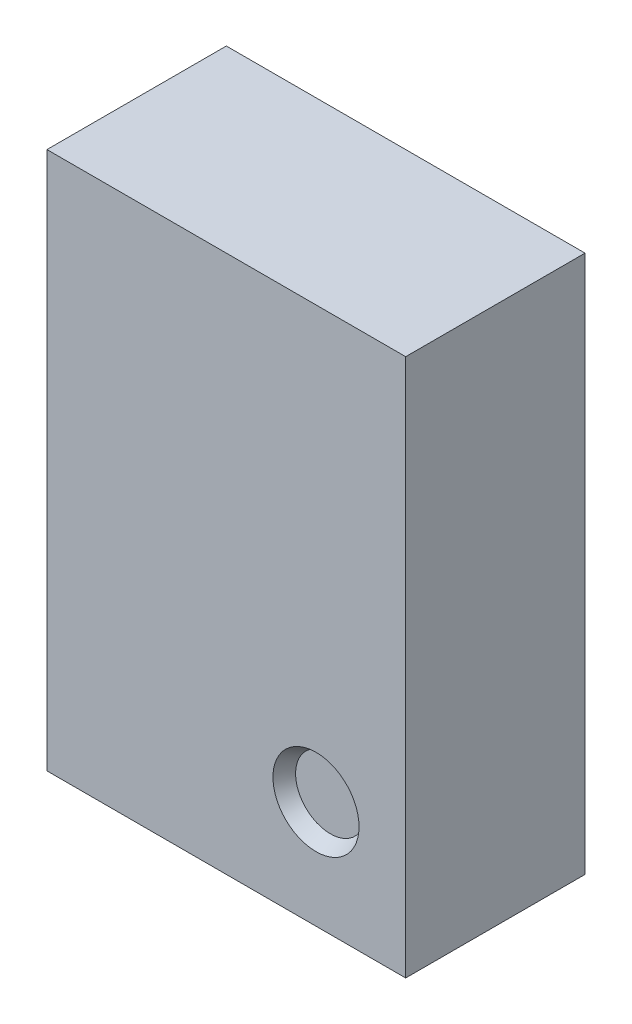
ISO-10303-21;
HEADER;
FILE_DESCRIPTION(('STEP AP214'),'2;1');
FILE_NAME('part.step','',(''),(''),'','','');
FILE_SCHEMA(('AUTOMOTIVE_DESIGN { 1 0 10303 214 1 1 1 1 }'));
ENDSEC;
DATA;
#1=APPLICATION_CONTEXT('core data for automotive mechanical design processes');
#2=APPLICATION_PROTOCOL_DEFINITION('international standard','automotive_design',2000,#1);
#3=PRODUCT_CONTEXT('',#1,'mechanical');
#4=PRODUCT('Part','Part','',(#3));
#5=PRODUCT_RELATED_PRODUCT_CATEGORY('part','',(#4));
#6=PRODUCT_DEFINITION_FORMATION('','',#4);
#7=PRODUCT_DEFINITION_CONTEXT('part definition',#1,'design');
#8=PRODUCT_DEFINITION('design','',#6,#7);
#9=PRODUCT_DEFINITION_SHAPE('','',#8);
#10=(LENGTH_UNIT() NAMED_UNIT(*) SI_UNIT(.MILLI.,.METRE.));
#11=(NAMED_UNIT(*) PLANE_ANGLE_UNIT() SI_UNIT($,.RADIAN.));
#12=(NAMED_UNIT(*) SI_UNIT($,.STERADIAN.) SOLID_ANGLE_UNIT());
#13=UNCERTAINTY_MEASURE_WITH_UNIT(LENGTH_MEASURE(1.E-05),#10,'distance_accuracy_value','');
#14=(GEOMETRIC_REPRESENTATION_CONTEXT(3) GLOBAL_UNCERTAINTY_ASSIGNED_CONTEXT((#13)) GLOBAL_UNIT_ASSIGNED_CONTEXT((#10,
#11,#12)) REPRESENTATION_CONTEXT('',''));
#15=CARTESIAN_POINT('',(0.,0.,0.));
#16=DIRECTION('',(0.,0.,1.));
#17=DIRECTION('',(1.,0.,0.));
#18=AXIS2_PLACEMENT_3D('',#15,#16,#17);
#19=CARTESIAN_POINT('',(80.745,39.36,2.013254));
#20=DIRECTION('',(0.,0.,1.));
#21=DIRECTION('',(1.,0.,0.));
#22=AXIS2_PLACEMENT_3D('',#19,#20,#21);
#23=PLANE('',#22);
#24=DIRECTION('',(0.,-1.,0.));
#25=VECTOR('',#24,1.);
#26=CARTESIAN_POINT('',(81.045,39.36,2.013254));
#27=LINE('',#26,#25);
#28=CARTESIAN_POINT('',(81.045,39.36,2.013254));
#29=VERTEX_POINT('',#28);
#30=CARTESIAN_POINT('',(81.045,39.11,2.013254));
#31=VERTEX_POINT('',#30);
#32=EDGE_CURVE('E201',#29,#31,#27,.T.);
#33=ORIENTED_EDGE('',*,*,#32,.T.);
#34=DIRECTION('',(-1.,0.,0.));
#35=VECTOR('',#34,1.);
#36=CARTESIAN_POINT('',(81.045,39.11,2.013254));
#37=LINE('',#36,#35);
#38=CARTESIAN_POINT('',(80.745,39.11,2.013254));
#39=VERTEX_POINT('',#38);
#40=EDGE_CURVE('E198',#31,#39,#37,.T.);
#41=ORIENTED_EDGE('',*,*,#40,.T.);
#42=DIRECTION('',(0.,1.,0.));
#43=VECTOR('',#42,1.);
#44=CARTESIAN_POINT('',(80.745,39.36,2.013254));
#45=LINE('',#44,#43);
#46=CARTESIAN_POINT('',(80.745,39.36,2.013254));
#47=VERTEX_POINT('',#46);
#48=EDGE_CURVE('E215',#39,#47,#45,.T.);
#49=ORIENTED_EDGE('',*,*,#48,.T.);
#50=DIRECTION('',(1.,0.,0.));
#51=VECTOR('',#50,1.);
#52=CARTESIAN_POINT('',(81.045,39.36,2.013254));
#53=LINE('',#52,#51);
#54=EDGE_CURVE('E204',#47,#29,#53,.T.);
#55=ORIENTED_EDGE('',*,*,#54,.T.);
#56=EDGE_LOOP('',(#33,#41,#49,#55));
#57=FACE_BOUND('',#56,.T.);
#58=ADVANCED_FACE('F17',(#57),#23,.F.);
#59=CARTESIAN_POINT('',(80.545,39.36,2.013254));
#60=DIRECTION('',(0.,0.,-1.));
#61=DIRECTION('',(-1.,0.,0.));
#62=AXIS2_PLACEMENT_3D('',#59,#60,#61);
#63=PLANE('',#62);
#64=DIRECTION('',(-1.,0.,0.));
#65=VECTOR('',#64,1.);
#66=CARTESIAN_POINT('',(80.245,39.11,2.013254));
#67=LINE('',#66,#65);
#68=CARTESIAN_POINT('',(80.545,39.11,2.013254));
#69=VERTEX_POINT('',#68);
#70=CARTESIAN_POINT('',(80.245,39.11,2.013254));
#71=VERTEX_POINT('',#70);
#72=EDGE_CURVE('E233',#69,#71,#67,.T.);
#73=ORIENTED_EDGE('',*,*,#72,.T.);
#74=DIRECTION('',(0.,1.,0.));
#75=VECTOR('',#74,1.);
#76=CARTESIAN_POINT('',(80.245,39.36,2.013254));
#77=LINE('',#76,#75);
#78=CARTESIAN_POINT('',(80.245,39.36,2.013254));
#79=VERTEX_POINT('',#78);
#80=EDGE_CURVE('E238',#71,#79,#77,.T.);
#81=ORIENTED_EDGE('',*,*,#80,.T.);
#82=DIRECTION('',(1.,0.,0.));
#83=VECTOR('',#82,1.);
#84=CARTESIAN_POINT('',(80.245,39.36,2.013254));
#85=LINE('',#84,#83);
#86=CARTESIAN_POINT('',(80.545,39.36,2.013254));
#87=VERTEX_POINT('',#86);
#88=EDGE_CURVE('E243',#79,#87,#85,.T.);
#89=ORIENTED_EDGE('',*,*,#88,.T.);
#90=DIRECTION('',(0.,-1.,0.));
#91=VECTOR('',#90,1.);
#92=CARTESIAN_POINT('',(80.545,39.36,2.013254));
#93=LINE('',#92,#91);
#94=EDGE_CURVE('E231',#87,#69,#93,.T.);
#95=ORIENTED_EDGE('',*,*,#94,.T.);
#96=EDGE_LOOP('',(#73,#81,#89,#95));
#97=FACE_BOUND('',#96,.T.);
#98=ADVANCED_FACE('F563',(#97),#63,.T.);
#99=CARTESIAN_POINT('',(80.545,38.36,2.013254));
#100=DIRECTION('',(0.,0.,1.));
#101=DIRECTION('',(1.,0.,0.));
#102=AXIS2_PLACEMENT_3D('',#99,#100,#101);
#103=PLANE('',#102);
#104=DIRECTION('',(0.,-1.,0.));
#105=VECTOR('',#104,1.);
#106=CARTESIAN_POINT('',(80.545,38.11,2.013254));
#107=LINE('',#106,#105);
#108=CARTESIAN_POINT('',(80.545,38.36,2.013254));
#109=VERTEX_POINT('',#108);
#110=CARTESIAN_POINT('',(80.545,38.11,2.013254));
#111=VERTEX_POINT('',#110);
#112=EDGE_CURVE('E250',#109,#111,#107,.T.);
#113=ORIENTED_EDGE('',*,*,#112,.T.);
#114=DIRECTION('',(-1.,0.,0.));
#115=VECTOR('',#114,1.);
#116=CARTESIAN_POINT('',(80.245,38.11,2.013254));
#117=LINE('',#116,#115);
#118=CARTESIAN_POINT('',(80.245,38.11,2.013254));
#119=VERTEX_POINT('',#118);
#120=EDGE_CURVE('E252',#111,#119,#117,.T.);
#121=ORIENTED_EDGE('',*,*,#120,.T.);
#122=DIRECTION('',(0.,1.,0.));
#123=VECTOR('',#122,1.);
#124=CARTESIAN_POINT('',(80.245,38.11,2.013254));
#125=LINE('',#124,#123);
#126=CARTESIAN_POINT('',(80.245,38.36,2.013254));
#127=VERTEX_POINT('',#126);
#128=EDGE_CURVE('E257',#119,#127,#125,.T.);
#129=ORIENTED_EDGE('',*,*,#128,.T.);
#130=DIRECTION('',(1.,0.,0.));
#131=VECTOR('',#130,1.);
#132=CARTESIAN_POINT('',(80.245,38.36,2.013254));
#133=LINE('',#132,#131);
#134=EDGE_CURVE('E262',#127,#109,#133,.T.);
#135=ORIENTED_EDGE('',*,*,#134,.T.);
#136=EDGE_LOOP('',(#113,#121,#129,#135));
#137=FACE_BOUND('',#136,.T.);
#138=ADVANCED_FACE('F560',(#137),#103,.F.);
#139=CARTESIAN_POINT('',(80.545,38.86,2.013254));
#140=DIRECTION('',(0.,0.,-1.));
#141=DIRECTION('',(-1.,0.,0.));
#142=AXIS2_PLACEMENT_3D('',#139,#140,#141);
#143=PLANE('',#142);
#144=DIRECTION('',(-1.,0.,0.));
#145=VECTOR('',#144,1.);
#146=CARTESIAN_POINT('',(80.245,38.61,2.013254));
#147=LINE('',#146,#145);
#148=CARTESIAN_POINT('',(80.545,38.61,2.013254));
#149=VERTEX_POINT('',#148);
#150=CARTESIAN_POINT('',(80.245,38.61,2.013254));
#151=VERTEX_POINT('',#150);
#152=EDGE_CURVE('E271',#149,#151,#147,.T.);
#153=ORIENTED_EDGE('',*,*,#152,.T.);
#154=DIRECTION('',(0.,1.,0.));
#155=VECTOR('',#154,1.);
#156=CARTESIAN_POINT('',(80.245,38.86,2.013254));
#157=LINE('',#156,#155);
#158=CARTESIAN_POINT('',(80.245,38.86,2.013254));
#159=VERTEX_POINT('',#158);
#160=EDGE_CURVE('E276',#151,#159,#157,.T.);
#161=ORIENTED_EDGE('',*,*,#160,.T.);
#162=DIRECTION('',(1.,0.,0.));
#163=VECTOR('',#162,1.);
#164=CARTESIAN_POINT('',(80.245,38.86,2.013254));
#165=LINE('',#164,#163);
#166=CARTESIAN_POINT('',(80.545,38.86,2.013254));
#167=VERTEX_POINT('',#166);
#168=EDGE_CURVE('E281',#159,#167,#165,.T.);
#169=ORIENTED_EDGE('',*,*,#168,.T.);
#170=DIRECTION('',(0.,-1.,0.));
#171=VECTOR('',#170,1.);
#172=CARTESIAN_POINT('',(80.545,38.86,2.013254));
#173=LINE('',#172,#171);
#174=EDGE_CURVE('E269',#167,#149,#173,.T.);
#175=ORIENTED_EDGE('',*,*,#174,.T.);
#176=EDGE_LOOP('',(#153,#161,#169,#175));
#177=FACE_BOUND('',#176,.T.);
#178=ADVANCED_FACE('F556',(#177),#143,.T.);
#179=CARTESIAN_POINT('',(80.745,38.86,2.013254));
#180=DIRECTION('',(0.,0.,1.));
#181=DIRECTION('',(1.,0.,0.));
#182=AXIS2_PLACEMENT_3D('',#179,#180,#181);
#183=PLANE('',#182);
#184=DIRECTION('',(0.,-1.,0.));
#185=VECTOR('',#184,1.);
#186=CARTESIAN_POINT('',(81.045,38.86,2.013254));
#187=LINE('',#186,#185);
#188=CARTESIAN_POINT('',(81.045,38.86,2.013254));
#189=VERTEX_POINT('',#188);
#190=CARTESIAN_POINT('',(81.045,38.61,2.013254));
#191=VERTEX_POINT('',#190);
#192=EDGE_CURVE('E288',#189,#191,#187,.T.);
#193=ORIENTED_EDGE('',*,*,#192,.T.);
#194=DIRECTION('',(-1.,0.,0.));
#195=VECTOR('',#194,1.);
#196=CARTESIAN_POINT('',(81.045,38.61,2.013254));
#197=LINE('',#196,#195);
#198=CARTESIAN_POINT('',(80.745,38.61,2.013254));
#199=VERTEX_POINT('',#198);
#200=EDGE_CURVE('E290',#191,#199,#197,.T.);
#201=ORIENTED_EDGE('',*,*,#200,.T.);
#202=DIRECTION('',(0.,1.,0.));
#203=VECTOR('',#202,1.);
#204=CARTESIAN_POINT('',(80.745,38.86,2.013254));
#205=LINE('',#204,#203);
#206=CARTESIAN_POINT('',(80.745,38.86,2.013254));
#207=VERTEX_POINT('',#206);
#208=EDGE_CURVE('E295',#199,#207,#205,.T.);
#209=ORIENTED_EDGE('',*,*,#208,.T.);
#210=DIRECTION('',(1.,0.,0.));
#211=VECTOR('',#210,1.);
#212=CARTESIAN_POINT('',(81.045,38.86,2.013254));
#213=LINE('',#212,#211);
#214=EDGE_CURVE('E300',#207,#189,#213,.T.);
#215=ORIENTED_EDGE('',*,*,#214,.T.);
#216=EDGE_LOOP('',(#193,#201,#209,#215));
#217=FACE_BOUND('',#216,.T.);
#218=ADVANCED_FACE('F552',(#217),#183,.F.);
#219=CARTESIAN_POINT('',(80.745,38.11,2.013254));
#220=DIRECTION('',(0.,0.,-1.));
#221=DIRECTION('',(-1.,0.,0.));
#222=AXIS2_PLACEMENT_3D('',#219,#220,#221);
#223=PLANE('',#222);
#224=DIRECTION('',(1.,0.,0.));
#225=VECTOR('',#224,1.);
#226=CARTESIAN_POINT('',(81.045,38.36,2.013254));
#227=LINE('',#226,#225);
#228=CARTESIAN_POINT('',(80.745,38.36,2.013254));
#229=VERTEX_POINT('',#228);
#230=CARTESIAN_POINT('',(81.045,38.36,2.013254));
#231=VERTEX_POINT('',#230);
#232=EDGE_CURVE('E309',#229,#231,#227,.T.);
#233=ORIENTED_EDGE('',*,*,#232,.T.);
#234=DIRECTION('',(0.,-1.,0.));
#235=VECTOR('',#234,1.);
#236=CARTESIAN_POINT('',(81.045,38.11,2.013254));
#237=LINE('',#236,#235);
#238=CARTESIAN_POINT('',(81.045,38.11,2.013254));
#239=VERTEX_POINT('',#238);
#240=EDGE_CURVE('E314',#231,#239,#237,.T.);
#241=ORIENTED_EDGE('',*,*,#240,.T.);
#242=DIRECTION('',(-1.,0.,0.));
#243=VECTOR('',#242,1.);
#244=CARTESIAN_POINT('',(81.045,38.11,2.013254));
#245=LINE('',#244,#243);
#246=CARTESIAN_POINT('',(80.745,38.11,2.013254));
#247=VERTEX_POINT('',#246);
#248=EDGE_CURVE('E319',#239,#247,#245,.T.);
#249=ORIENTED_EDGE('',*,*,#248,.T.);
#250=DIRECTION('',(0.,1.,0.));
#251=VECTOR('',#250,1.);
#252=CARTESIAN_POINT('',(80.745,38.11,2.013254));
#253=LINE('',#252,#251);
#254=EDGE_CURVE('E307',#247,#229,#253,.T.);
#255=ORIENTED_EDGE('',*,*,#254,.T.);
#256=EDGE_LOOP('',(#233,#241,#249,#255));
#257=FACE_BOUND('',#256,.T.);
#258=ADVANCED_FACE('F549',(#257),#223,.T.);
#259=CARTESIAN_POINT('',(81.045,39.36,2.213254));
#260=DIRECTION('',(-1.,0.,0.));
#261=DIRECTION('',(0.,-1.,0.));
#262=AXIS2_PLACEMENT_3D('',#259,#260,#261);
#263=PLANE('',#262);
#264=DIRECTION('',(0.,1.,0.));
#265=VECTOR('',#264,1.);
#266=CARTESIAN_POINT('',(81.045,37.985,2.023254));
#267=LINE('',#266,#265);
#268=CARTESIAN_POINT('',(81.045,39.36,2.023254));
#269=VERTEX_POINT('',#268);
#270=CARTESIAN_POINT('',(81.045,39.11,2.023254));
#271=VERTEX_POINT('',#270);
#272=EDGE_CURVE('E212',#269,#271,#267,.F.);
#273=ORIENTED_EDGE('',*,*,#272,.T.);
#274=DIRECTION('',(0.,0.,1.));
#275=VECTOR('',#274,1.);
#276=CARTESIAN_POINT('',(81.045,39.11,2.213254));
#277=LINE('',#276,#275);
#278=EDGE_CURVE('E209',#271,#31,#277,.F.);
#279=ORIENTED_EDGE('',*,*,#278,.T.);
#280=ORIENTED_EDGE('',*,*,#32,.F.);
#281=DIRECTION('',(0.,0.,1.));
#282=VECTOR('',#281,1.);
#283=CARTESIAN_POINT('',(81.045,39.36,2.213254));
#284=LINE('',#283,#282);
#285=EDGE_CURVE('E226',#29,#269,#284,.T.);
#286=ORIENTED_EDGE('',*,*,#285,.T.);
#287=EDGE_LOOP('',(#273,#279,#280,#286));
#288=FACE_BOUND('',#287,.T.);
#289=ADVANCED_FACE('F210',(#288),#263,.F.);
#290=CARTESIAN_POINT('',(81.045,39.11,2.213254));
#291=DIRECTION('',(0.,1.,0.));
#292=DIRECTION('',(-1.,0.,0.));
#293=AXIS2_PLACEMENT_3D('',#290,#291,#292);
#294=PLANE('',#293);
#295=DIRECTION('',(1.,0.,0.));
#296=VECTOR('',#295,1.);
#297=CARTESIAN_POINT('',(81.145,39.11,2.023254));
#298=LINE('',#297,#296);
#299=CARTESIAN_POINT('',(80.745,39.11,2.023254));
#300=VERTEX_POINT('',#299);
#301=EDGE_CURVE('E327',#271,#300,#298,.F.);
#302=ORIENTED_EDGE('',*,*,#301,.T.);
#303=DIRECTION('',(0.,0.,1.));
#304=VECTOR('',#303,1.);
#305=CARTESIAN_POINT('',(80.745,39.11,2.213254));
#306=LINE('',#305,#304);
#307=EDGE_CURVE('E219',#300,#39,#306,.F.);
#308=ORIENTED_EDGE('',*,*,#307,.T.);
#309=ORIENTED_EDGE('',*,*,#40,.F.);
#310=ORIENTED_EDGE('',*,*,#278,.F.);
#311=EDGE_LOOP('',(#302,#308,#309,#310));
#312=FACE_BOUND('',#311,.T.);
#313=ADVANCED_FACE('F217',(#312),#294,.F.);
#314=CARTESIAN_POINT('',(80.745,39.36,2.213254));
#315=DIRECTION('',(1.,0.,0.));
#316=DIRECTION('',(0.,1.,0.));
#317=AXIS2_PLACEMENT_3D('',#314,#315,#316);
#318=PLANE('',#317);
#319=DIRECTION('',(0.,1.,0.));
#320=VECTOR('',#319,1.);
#321=CARTESIAN_POINT('',(80.745,37.985,2.023254));
#322=LINE('',#321,#320);
#323=CARTESIAN_POINT('',(80.745,39.36,2.023254));
#324=VERTEX_POINT('',#323);
#325=EDGE_CURVE('E329',#300,#324,#322,.T.);
#326=ORIENTED_EDGE('',*,*,#325,.T.);
#327=DIRECTION('',(0.,0.,1.));
#328=VECTOR('',#327,1.);
#329=CARTESIAN_POINT('',(80.745,39.36,2.213254));
#330=LINE('',#329,#328);
#331=EDGE_CURVE('E228',#324,#47,#330,.F.);
#332=ORIENTED_EDGE('',*,*,#331,.T.);
#333=ORIENTED_EDGE('',*,*,#48,.F.);
#334=ORIENTED_EDGE('',*,*,#307,.F.);
#335=EDGE_LOOP('',(#326,#332,#333,#334));
#336=FACE_BOUND('',#335,.T.);
#337=ADVANCED_FACE('F540',(#336),#318,.F.);
#338=CARTESIAN_POINT('',(81.045,39.36,2.213254));
#339=DIRECTION('',(0.,-1.,0.));
#340=DIRECTION('',(1.,0.,0.));
#341=AXIS2_PLACEMENT_3D('',#338,#339,#340);
#342=PLANE('',#341);
#343=DIRECTION('',(1.,0.,0.));
#344=VECTOR('',#343,1.);
#345=CARTESIAN_POINT('',(81.145,39.36,2.023254));
#346=LINE('',#345,#344);
#347=EDGE_CURVE('E331',#324,#269,#346,.T.);
#348=ORIENTED_EDGE('',*,*,#347,.T.);
#349=ORIENTED_EDGE('',*,*,#285,.F.);
#350=ORIENTED_EDGE('',*,*,#54,.F.);
#351=ORIENTED_EDGE('',*,*,#331,.F.);
#352=EDGE_LOOP('',(#348,#349,#350,#351));
#353=FACE_BOUND('',#352,.T.);
#354=ADVANCED_FACE('F536',(#353),#342,.F.);
#355=CARTESIAN_POINT('',(80.545,39.36,2.213254));
#356=DIRECTION('',(-1.,0.,0.));
#357=DIRECTION('',(0.,-1.,0.));
#358=AXIS2_PLACEMENT_3D('',#355,#356,#357);
#359=PLANE('',#358);
#360=DIRECTION('',(0.,1.,0.));
#361=VECTOR('',#360,1.);
#362=CARTESIAN_POINT('',(80.545,37.985,2.023254));
#363=LINE('',#362,#361);
#364=CARTESIAN_POINT('',(80.545,39.36,2.023254));
#365=VERTEX_POINT('',#364);
#366=CARTESIAN_POINT('',(80.545,39.11,2.023254));
#367=VERTEX_POINT('',#366);
#368=EDGE_CURVE('E334',#365,#367,#363,.F.);
#369=ORIENTED_EDGE('',*,*,#368,.T.);
#370=DIRECTION('',(0.,0.,1.));
#371=VECTOR('',#370,1.);
#372=CARTESIAN_POINT('',(80.545,39.11,2.213254));
#373=LINE('',#372,#371);
#374=EDGE_CURVE('E235',#367,#69,#373,.F.);
#375=ORIENTED_EDGE('',*,*,#374,.T.);
#376=ORIENTED_EDGE('',*,*,#94,.F.);
#377=DIRECTION('',(0.,0.,1.));
#378=VECTOR('',#377,1.);
#379=CARTESIAN_POINT('',(80.545,39.36,2.213254));
#380=LINE('',#379,#378);
#381=EDGE_CURVE('E245',#87,#365,#380,.T.);
#382=ORIENTED_EDGE('',*,*,#381,.T.);
#383=EDGE_LOOP('',(#369,#375,#376,#382));
#384=FACE_BOUND('',#383,.T.);
#385=ADVANCED_FACE('F532',(#384),#359,.F.);
#386=CARTESIAN_POINT('',(80.245,39.11,2.213254));
#387=DIRECTION('',(0.,1.,0.));
#388=DIRECTION('',(-1.,0.,0.));
#389=AXIS2_PLACEMENT_3D('',#386,#387,#388);
#390=PLANE('',#389);
#391=DIRECTION('',(1.,0.,0.));
#392=VECTOR('',#391,1.);
#393=CARTESIAN_POINT('',(81.145,39.11,2.023254));
#394=LINE('',#393,#392);
#395=CARTESIAN_POINT('',(80.245,39.11,2.023254));
#396=VERTEX_POINT('',#395);
#397=EDGE_CURVE('E336',#367,#396,#394,.F.);
#398=ORIENTED_EDGE('',*,*,#397,.T.);
#399=DIRECTION('',(0.,0.,1.));
#400=VECTOR('',#399,1.);
#401=CARTESIAN_POINT('',(80.245,39.11,2.213254));
#402=LINE('',#401,#400);
#403=EDGE_CURVE('E240',#396,#71,#402,.F.);
#404=ORIENTED_EDGE('',*,*,#403,.T.);
#405=ORIENTED_EDGE('',*,*,#72,.F.);
#406=ORIENTED_EDGE('',*,*,#374,.F.);
#407=EDGE_LOOP('',(#398,#404,#405,#406));
#408=FACE_BOUND('',#407,.T.);
#409=ADVANCED_FACE('F528',(#408),#390,.F.);
#410=CARTESIAN_POINT('',(80.245,39.36,2.213254));
#411=DIRECTION('',(1.,0.,0.));
#412=DIRECTION('',(0.,1.,0.));
#413=AXIS2_PLACEMENT_3D('',#410,#411,#412);
#414=PLANE('',#413);
#415=DIRECTION('',(0.,1.,0.));
#416=VECTOR('',#415,1.);
#417=CARTESIAN_POINT('',(80.245,37.985,2.023254));
#418=LINE('',#417,#416);
#419=CARTESIAN_POINT('',(80.245,39.36,2.023254));
#420=VERTEX_POINT('',#419);
#421=EDGE_CURVE('E338',#396,#420,#418,.T.);
#422=ORIENTED_EDGE('',*,*,#421,.T.);
#423=DIRECTION('',(0.,0.,1.));
#424=VECTOR('',#423,1.);
#425=CARTESIAN_POINT('',(80.245,39.36,2.213254));
#426=LINE('',#425,#424);
#427=EDGE_CURVE('E247',#420,#79,#426,.F.);
#428=ORIENTED_EDGE('',*,*,#427,.T.);
#429=ORIENTED_EDGE('',*,*,#80,.F.);
#430=ORIENTED_EDGE('',*,*,#403,.F.);
#431=EDGE_LOOP('',(#422,#428,#429,#430));
#432=FACE_BOUND('',#431,.T.);
#433=ADVANCED_FACE('F524',(#432),#414,.F.);
#434=CARTESIAN_POINT('',(80.245,39.36,2.213254));
#435=DIRECTION('',(0.,-1.,0.));
#436=DIRECTION('',(1.,0.,0.));
#437=AXIS2_PLACEMENT_3D('',#434,#435,#436);
#438=PLANE('',#437);
#439=DIRECTION('',(1.,0.,0.));
#440=VECTOR('',#439,1.);
#441=CARTESIAN_POINT('',(81.145,39.36,2.023254));
#442=LINE('',#441,#440);
#443=EDGE_CURVE('E340',#420,#365,#442,.T.);
#444=ORIENTED_EDGE('',*,*,#443,.T.);
#445=ORIENTED_EDGE('',*,*,#381,.F.);
#446=ORIENTED_EDGE('',*,*,#88,.F.);
#447=ORIENTED_EDGE('',*,*,#427,.F.);
#448=EDGE_LOOP('',(#444,#445,#446,#447));
#449=FACE_BOUND('',#448,.T.);
#450=ADVANCED_FACE('F520',(#449),#438,.F.);
#451=CARTESIAN_POINT('',(80.545,38.11,2.213254));
#452=DIRECTION('',(-1.,0.,0.));
#453=DIRECTION('',(0.,-1.,0.));
#454=AXIS2_PLACEMENT_3D('',#451,#452,#453);
#455=PLANE('',#454);
#456=DIRECTION('',(0.,1.,0.));
#457=VECTOR('',#456,1.);
#458=CARTESIAN_POINT('',(80.545,37.985,2.023254));
#459=LINE('',#458,#457);
#460=CARTESIAN_POINT('',(80.545,38.36,2.023254));
#461=VERTEX_POINT('',#460);
#462=CARTESIAN_POINT('',(80.545,38.11,2.023254));
#463=VERTEX_POINT('',#462);
#464=EDGE_CURVE('E343',#461,#463,#459,.F.);
#465=ORIENTED_EDGE('',*,*,#464,.T.);
#466=DIRECTION('',(0.,0.,1.));
#467=VECTOR('',#466,1.);
#468=CARTESIAN_POINT('',(80.545,38.11,2.213254));
#469=LINE('',#468,#467);
#470=EDGE_CURVE('E254',#463,#111,#469,.F.);
#471=ORIENTED_EDGE('',*,*,#470,.T.);
#472=ORIENTED_EDGE('',*,*,#112,.F.);
#473=DIRECTION('',(0.,0.,1.));
#474=VECTOR('',#473,1.);
#475=CARTESIAN_POINT('',(80.545,38.36,2.213254));
#476=LINE('',#475,#474);
#477=EDGE_CURVE('E264',#109,#461,#476,.T.);
#478=ORIENTED_EDGE('',*,*,#477,.T.);
#479=EDGE_LOOP('',(#465,#471,#472,#478));
#480=FACE_BOUND('',#479,.T.);
#481=ADVANCED_FACE('F516',(#480),#455,.F.);
#482=CARTESIAN_POINT('',(80.245,38.11,2.213254));
#483=DIRECTION('',(0.,1.,0.));
#484=DIRECTION('',(-1.,0.,0.));
#485=AXIS2_PLACEMENT_3D('',#482,#483,#484);
#486=PLANE('',#485);
#487=DIRECTION('',(1.,0.,0.));
#488=VECTOR('',#487,1.);
#489=CARTESIAN_POINT('',(81.145,38.11,2.023254));
#490=LINE('',#489,#488);
#491=CARTESIAN_POINT('',(80.245,38.11,2.023254));
#492=VERTEX_POINT('',#491);
#493=EDGE_CURVE('E345',#463,#492,#490,.F.);
#494=ORIENTED_EDGE('',*,*,#493,.T.);
#495=DIRECTION('',(0.,0.,1.));
#496=VECTOR('',#495,1.);
#497=CARTESIAN_POINT('',(80.245,38.11,2.213254));
#498=LINE('',#497,#496);
#499=EDGE_CURVE('E259',#492,#119,#498,.F.);
#500=ORIENTED_EDGE('',*,*,#499,.T.);
#501=ORIENTED_EDGE('',*,*,#120,.F.);
#502=ORIENTED_EDGE('',*,*,#470,.F.);
#503=EDGE_LOOP('',(#494,#500,#501,#502));
#504=FACE_BOUND('',#503,.T.);
#505=ADVANCED_FACE('F512',(#504),#486,.F.);
#506=CARTESIAN_POINT('',(80.245,38.11,2.213254));
#507=DIRECTION('',(1.,0.,0.));
#508=DIRECTION('',(0.,1.,0.));
#509=AXIS2_PLACEMENT_3D('',#506,#507,#508);
#510=PLANE('',#509);
#511=DIRECTION('',(0.,1.,0.));
#512=VECTOR('',#511,1.);
#513=CARTESIAN_POINT('',(80.245,37.985,2.023254));
#514=LINE('',#513,#512);
#515=CARTESIAN_POINT('',(80.245,38.36,2.023254));
#516=VERTEX_POINT('',#515);
#517=EDGE_CURVE('E347',#492,#516,#514,.T.);
#518=ORIENTED_EDGE('',*,*,#517,.T.);
#519=DIRECTION('',(0.,0.,1.));
#520=VECTOR('',#519,1.);
#521=CARTESIAN_POINT('',(80.245,38.36,2.213254));
#522=LINE('',#521,#520);
#523=EDGE_CURVE('E266',#516,#127,#522,.F.);
#524=ORIENTED_EDGE('',*,*,#523,.T.);
#525=ORIENTED_EDGE('',*,*,#128,.F.);
#526=ORIENTED_EDGE('',*,*,#499,.F.);
#527=EDGE_LOOP('',(#518,#524,#525,#526));
#528=FACE_BOUND('',#527,.T.);
#529=ADVANCED_FACE('F508',(#528),#510,.F.);
#530=CARTESIAN_POINT('',(80.245,38.36,2.213254));
#531=DIRECTION('',(0.,-1.,0.));
#532=DIRECTION('',(1.,0.,0.));
#533=AXIS2_PLACEMENT_3D('',#530,#531,#532);
#534=PLANE('',#533);
#535=DIRECTION('',(1.,0.,0.));
#536=VECTOR('',#535,1.);
#537=CARTESIAN_POINT('',(81.145,38.36,2.023254));
#538=LINE('',#537,#536);
#539=EDGE_CURVE('E349',#516,#461,#538,.T.);
#540=ORIENTED_EDGE('',*,*,#539,.T.);
#541=ORIENTED_EDGE('',*,*,#477,.F.);
#542=ORIENTED_EDGE('',*,*,#134,.F.);
#543=ORIENTED_EDGE('',*,*,#523,.F.);
#544=EDGE_LOOP('',(#540,#541,#542,#543));
#545=FACE_BOUND('',#544,.T.);
#546=ADVANCED_FACE('F504',(#545),#534,.F.);
#547=CARTESIAN_POINT('',(80.545,38.86,2.213254));
#548=DIRECTION('',(-1.,0.,0.));
#549=DIRECTION('',(0.,-1.,0.));
#550=AXIS2_PLACEMENT_3D('',#547,#548,#549);
#551=PLANE('',#550);
#552=DIRECTION('',(0.,1.,0.));
#553=VECTOR('',#552,1.);
#554=CARTESIAN_POINT('',(80.545,37.985,2.023254));
#555=LINE('',#554,#553);
#556=CARTESIAN_POINT('',(80.545,38.86,2.023254));
#557=VERTEX_POINT('',#556);
#558=CARTESIAN_POINT('',(80.545,38.61,2.023254));
#559=VERTEX_POINT('',#558);
#560=EDGE_CURVE('E352',#557,#559,#555,.F.);
#561=ORIENTED_EDGE('',*,*,#560,.T.);
#562=DIRECTION('',(0.,0.,1.));
#563=VECTOR('',#562,1.);
#564=CARTESIAN_POINT('',(80.545,38.61,2.213254));
#565=LINE('',#564,#563);
#566=EDGE_CURVE('E273',#559,#149,#565,.F.);
#567=ORIENTED_EDGE('',*,*,#566,.T.);
#568=ORIENTED_EDGE('',*,*,#174,.F.);
#569=DIRECTION('',(0.,0.,1.));
#570=VECTOR('',#569,1.);
#571=CARTESIAN_POINT('',(80.545,38.86,2.213254));
#572=LINE('',#571,#570);
#573=EDGE_CURVE('E283',#167,#557,#572,.T.);
#574=ORIENTED_EDGE('',*,*,#573,.T.);
#575=EDGE_LOOP('',(#561,#567,#568,#574));
#576=FACE_BOUND('',#575,.T.);
#577=ADVANCED_FACE('F500',(#576),#551,.F.);
#578=CARTESIAN_POINT('',(80.245,38.61,2.213254));
#579=DIRECTION('',(0.,1.,0.));
#580=DIRECTION('',(-1.,0.,0.));
#581=AXIS2_PLACEMENT_3D('',#578,#579,#580);
#582=PLANE('',#581);
#583=DIRECTION('',(1.,0.,0.));
#584=VECTOR('',#583,1.);
#585=CARTESIAN_POINT('',(81.145,38.61,2.023254));
#586=LINE('',#585,#584);
#587=CARTESIAN_POINT('',(80.245,38.61,2.023254));
#588=VERTEX_POINT('',#587);
#589=EDGE_CURVE('E354',#559,#588,#586,.F.);
#590=ORIENTED_EDGE('',*,*,#589,.T.);
#591=DIRECTION('',(0.,0.,1.));
#592=VECTOR('',#591,1.);
#593=CARTESIAN_POINT('',(80.245,38.61,2.213254));
#594=LINE('',#593,#592);
#595=EDGE_CURVE('E278',#588,#151,#594,.F.);
#596=ORIENTED_EDGE('',*,*,#595,.T.);
#597=ORIENTED_EDGE('',*,*,#152,.F.);
#598=ORIENTED_EDGE('',*,*,#566,.F.);
#599=EDGE_LOOP('',(#590,#596,#597,#598));
#600=FACE_BOUND('',#599,.T.);
#601=ADVANCED_FACE('F496',(#600),#582,.F.);
#602=CARTESIAN_POINT('',(80.245,38.86,2.213254));
#603=DIRECTION('',(1.,0.,0.));
#604=DIRECTION('',(0.,1.,0.));
#605=AXIS2_PLACEMENT_3D('',#602,#603,#604);
#606=PLANE('',#605);
#607=DIRECTION('',(0.,1.,0.));
#608=VECTOR('',#607,1.);
#609=CARTESIAN_POINT('',(80.245,37.985,2.023254));
#610=LINE('',#609,#608);
#611=CARTESIAN_POINT('',(80.245,38.86,2.023254));
#612=VERTEX_POINT('',#611);
#613=EDGE_CURVE('E356',#588,#612,#610,.T.);
#614=ORIENTED_EDGE('',*,*,#613,.T.);
#615=DIRECTION('',(0.,0.,1.));
#616=VECTOR('',#615,1.);
#617=CARTESIAN_POINT('',(80.245,38.86,2.213254));
#618=LINE('',#617,#616);
#619=EDGE_CURVE('E285',#612,#159,#618,.F.);
#620=ORIENTED_EDGE('',*,*,#619,.T.);
#621=ORIENTED_EDGE('',*,*,#160,.F.);
#622=ORIENTED_EDGE('',*,*,#595,.F.);
#623=EDGE_LOOP('',(#614,#620,#621,#622));
#624=FACE_BOUND('',#623,.T.);
#625=ADVANCED_FACE('F492',(#624),#606,.F.);
#626=CARTESIAN_POINT('',(80.245,38.86,2.213254));
#627=DIRECTION('',(0.,-1.,0.));
#628=DIRECTION('',(1.,0.,0.));
#629=AXIS2_PLACEMENT_3D('',#626,#627,#628);
#630=PLANE('',#629);
#631=DIRECTION('',(1.,0.,0.));
#632=VECTOR('',#631,1.);
#633=CARTESIAN_POINT('',(81.145,38.86,2.023254));
#634=LINE('',#633,#632);
#635=EDGE_CURVE('E358',#612,#557,#634,.T.);
#636=ORIENTED_EDGE('',*,*,#635,.T.);
#637=ORIENTED_EDGE('',*,*,#573,.F.);
#638=ORIENTED_EDGE('',*,*,#168,.F.);
#639=ORIENTED_EDGE('',*,*,#619,.F.);
#640=EDGE_LOOP('',(#636,#637,#638,#639));
#641=FACE_BOUND('',#640,.T.);
#642=ADVANCED_FACE('F488',(#641),#630,.F.);
#643=CARTESIAN_POINT('',(81.045,38.86,2.213254));
#644=DIRECTION('',(-1.,0.,0.));
#645=DIRECTION('',(0.,-1.,0.));
#646=AXIS2_PLACEMENT_3D('',#643,#644,#645);
#647=PLANE('',#646);
#648=DIRECTION('',(0.,1.,0.));
#649=VECTOR('',#648,1.);
#650=CARTESIAN_POINT('',(81.045,37.985,2.023254));
#651=LINE('',#650,#649);
#652=CARTESIAN_POINT('',(81.045,38.86,2.023254));
#653=VERTEX_POINT('',#652);
#654=CARTESIAN_POINT('',(81.045,38.61,2.023254));
#655=VERTEX_POINT('',#654);
#656=EDGE_CURVE('E361',#653,#655,#651,.F.);
#657=ORIENTED_EDGE('',*,*,#656,.T.);
#658=DIRECTION('',(0.,0.,1.));
#659=VECTOR('',#658,1.);
#660=CARTESIAN_POINT('',(81.045,38.61,2.213254));
#661=LINE('',#660,#659);
#662=EDGE_CURVE('E292',#655,#191,#661,.F.);
#663=ORIENTED_EDGE('',*,*,#662,.T.);
#664=ORIENTED_EDGE('',*,*,#192,.F.);
#665=DIRECTION('',(0.,0.,1.));
#666=VECTOR('',#665,1.);
#667=CARTESIAN_POINT('',(81.045,38.86,2.213254));
#668=LINE('',#667,#666);
#669=EDGE_CURVE('E302',#189,#653,#668,.T.);
#670=ORIENTED_EDGE('',*,*,#669,.T.);
#671=EDGE_LOOP('',(#657,#663,#664,#670));
#672=FACE_BOUND('',#671,.T.);
#673=ADVANCED_FACE('F484',(#672),#647,.F.);
#674=CARTESIAN_POINT('',(81.045,38.61,2.213254));
#675=DIRECTION('',(0.,1.,0.));
#676=DIRECTION('',(-1.,0.,0.));
#677=AXIS2_PLACEMENT_3D('',#674,#675,#676);
#678=PLANE('',#677);
#679=DIRECTION('',(1.,0.,0.));
#680=VECTOR('',#679,1.);
#681=CARTESIAN_POINT('',(81.145,38.61,2.023254));
#682=LINE('',#681,#680);
#683=CARTESIAN_POINT('',(80.745,38.61,2.023254));
#684=VERTEX_POINT('',#683);
#685=EDGE_CURVE('E363',#655,#684,#682,.F.);
#686=ORIENTED_EDGE('',*,*,#685,.T.);
#687=DIRECTION('',(0.,0.,1.));
#688=VECTOR('',#687,1.);
#689=CARTESIAN_POINT('',(80.745,38.61,2.213254));
#690=LINE('',#689,#688);
#691=EDGE_CURVE('E297',#684,#199,#690,.F.);
#692=ORIENTED_EDGE('',*,*,#691,.T.);
#693=ORIENTED_EDGE('',*,*,#200,.F.);
#694=ORIENTED_EDGE('',*,*,#662,.F.);
#695=EDGE_LOOP('',(#686,#692,#693,#694));
#696=FACE_BOUND('',#695,.T.);
#697=ADVANCED_FACE('F480',(#696),#678,.F.);
#698=CARTESIAN_POINT('',(80.745,38.86,2.213254));
#699=DIRECTION('',(1.,0.,0.));
#700=DIRECTION('',(0.,1.,0.));
#701=AXIS2_PLACEMENT_3D('',#698,#699,#700);
#702=PLANE('',#701);
#703=DIRECTION('',(0.,1.,0.));
#704=VECTOR('',#703,1.);
#705=CARTESIAN_POINT('',(80.745,37.985,2.023254));
#706=LINE('',#705,#704);
#707=CARTESIAN_POINT('',(80.745,38.86,2.023254));
#708=VERTEX_POINT('',#707);
#709=EDGE_CURVE('E365',#684,#708,#706,.T.);
#710=ORIENTED_EDGE('',*,*,#709,.T.);
#711=DIRECTION('',(0.,0.,1.));
#712=VECTOR('',#711,1.);
#713=CARTESIAN_POINT('',(80.745,38.86,2.213254));
#714=LINE('',#713,#712);
#715=EDGE_CURVE('E304',#708,#207,#714,.F.);
#716=ORIENTED_EDGE('',*,*,#715,.T.);
#717=ORIENTED_EDGE('',*,*,#208,.F.);
#718=ORIENTED_EDGE('',*,*,#691,.F.);
#719=EDGE_LOOP('',(#710,#716,#717,#718));
#720=FACE_BOUND('',#719,.T.);
#721=ADVANCED_FACE('F476',(#720),#702,.F.);
#722=CARTESIAN_POINT('',(81.045,38.86,2.213254));
#723=DIRECTION('',(0.,-1.,0.));
#724=DIRECTION('',(1.,0.,0.));
#725=AXIS2_PLACEMENT_3D('',#722,#723,#724);
#726=PLANE('',#725);
#727=DIRECTION('',(1.,0.,0.));
#728=VECTOR('',#727,1.);
#729=CARTESIAN_POINT('',(81.145,38.86,2.023254));
#730=LINE('',#729,#728);
#731=EDGE_CURVE('E367',#708,#653,#730,.T.);
#732=ORIENTED_EDGE('',*,*,#731,.T.);
#733=ORIENTED_EDGE('',*,*,#669,.F.);
#734=ORIENTED_EDGE('',*,*,#214,.F.);
#735=ORIENTED_EDGE('',*,*,#715,.F.);
#736=EDGE_LOOP('',(#732,#733,#734,#735));
#737=FACE_BOUND('',#736,.T.);
#738=ADVANCED_FACE('F472',(#737),#726,.F.);
#739=CARTESIAN_POINT('',(80.745,38.11,2.213254));
#740=DIRECTION('',(1.,0.,0.));
#741=DIRECTION('',(0.,1.,0.));
#742=AXIS2_PLACEMENT_3D('',#739,#740,#741);
#743=PLANE('',#742);
#744=DIRECTION('',(0.,1.,0.));
#745=VECTOR('',#744,1.);
#746=CARTESIAN_POINT('',(80.745,37.985,2.023254));
#747=LINE('',#746,#745);
#748=CARTESIAN_POINT('',(80.745,38.11,2.023254));
#749=VERTEX_POINT('',#748);
#750=CARTESIAN_POINT('',(80.745,38.36,2.023254));
#751=VERTEX_POINT('',#750);
#752=EDGE_CURVE('E370',#749,#751,#747,.T.);
#753=ORIENTED_EDGE('',*,*,#752,.T.);
#754=DIRECTION('',(0.,0.,1.));
#755=VECTOR('',#754,1.);
#756=CARTESIAN_POINT('',(80.745,38.36,2.213254));
#757=LINE('',#756,#755);
#758=EDGE_CURVE('E311',#751,#229,#757,.F.);
#759=ORIENTED_EDGE('',*,*,#758,.T.);
#760=ORIENTED_EDGE('',*,*,#254,.F.);
#761=DIRECTION('',(0.,0.,1.));
#762=VECTOR('',#761,1.);
#763=CARTESIAN_POINT('',(80.745,38.11,2.213254));
#764=LINE('',#763,#762);
#765=EDGE_CURVE('E321',#247,#749,#764,.T.);
#766=ORIENTED_EDGE('',*,*,#765,.T.);
#767=EDGE_LOOP('',(#753,#759,#760,#766));
#768=FACE_BOUND('',#767,.T.);
#769=ADVANCED_FACE('F468',(#768),#743,.F.);
#770=CARTESIAN_POINT('',(81.045,38.36,2.213254));
#771=DIRECTION('',(0.,-1.,0.));
#772=DIRECTION('',(1.,0.,0.));
#773=AXIS2_PLACEMENT_3D('',#770,#771,#772);
#774=PLANE('',#773);
#775=DIRECTION('',(1.,0.,0.));
#776=VECTOR('',#775,1.);
#777=CARTESIAN_POINT('',(81.145,38.36,2.023254));
#778=LINE('',#777,#776);
#779=CARTESIAN_POINT('',(81.045,38.36,2.023254));
#780=VERTEX_POINT('',#779);
#781=EDGE_CURVE('E372',#751,#780,#778,.T.);
#782=ORIENTED_EDGE('',*,*,#781,.T.);
#783=DIRECTION('',(0.,0.,1.));
#784=VECTOR('',#783,1.);
#785=CARTESIAN_POINT('',(81.045,38.36,2.213254));
#786=LINE('',#785,#784);
#787=EDGE_CURVE('E316',#780,#231,#786,.F.);
#788=ORIENTED_EDGE('',*,*,#787,.T.);
#789=ORIENTED_EDGE('',*,*,#232,.F.);
#790=ORIENTED_EDGE('',*,*,#758,.F.);
#791=EDGE_LOOP('',(#782,#788,#789,#790));
#792=FACE_BOUND('',#791,.T.);
#793=ADVANCED_FACE('F464',(#792),#774,.F.);
#794=CARTESIAN_POINT('',(81.045,38.11,2.213254));
#795=DIRECTION('',(-1.,0.,0.));
#796=DIRECTION('',(0.,-1.,0.));
#797=AXIS2_PLACEMENT_3D('',#794,#795,#796);
#798=PLANE('',#797);
#799=DIRECTION('',(0.,1.,0.));
#800=VECTOR('',#799,1.);
#801=CARTESIAN_POINT('',(81.045,37.985,2.023254));
#802=LINE('',#801,#800);
#803=CARTESIAN_POINT('',(81.045,38.11,2.023254));
#804=VERTEX_POINT('',#803);
#805=EDGE_CURVE('E374',#780,#804,#802,.F.);
#806=ORIENTED_EDGE('',*,*,#805,.T.);
#807=DIRECTION('',(0.,0.,1.));
#808=VECTOR('',#807,1.);
#809=CARTESIAN_POINT('',(81.045,38.11,2.213254));
#810=LINE('',#809,#808);
#811=EDGE_CURVE('E323',#804,#239,#810,.F.);
#812=ORIENTED_EDGE('',*,*,#811,.T.);
#813=ORIENTED_EDGE('',*,*,#240,.F.);
#814=ORIENTED_EDGE('',*,*,#787,.F.);
#815=EDGE_LOOP('',(#806,#812,#813,#814));
#816=FACE_BOUND('',#815,.T.);
#817=ADVANCED_FACE('F460',(#816),#798,.F.);
#818=CARTESIAN_POINT('',(81.045,38.11,2.213254));
#819=DIRECTION('',(0.,1.,0.));
#820=DIRECTION('',(-1.,0.,0.));
#821=AXIS2_PLACEMENT_3D('',#818,#819,#820);
#822=PLANE('',#821);
#823=DIRECTION('',(1.,0.,0.));
#824=VECTOR('',#823,1.);
#825=CARTESIAN_POINT('',(81.145,38.11,2.023254));
#826=LINE('',#825,#824);
#827=EDGE_CURVE('E376',#804,#749,#826,.F.);
#828=ORIENTED_EDGE('',*,*,#827,.T.);
#829=ORIENTED_EDGE('',*,*,#765,.F.);
#830=ORIENTED_EDGE('',*,*,#248,.F.);
#831=ORIENTED_EDGE('',*,*,#811,.F.);
#832=EDGE_LOOP('',(#828,#829,#830,#831));
#833=FACE_BOUND('',#832,.T.);
#834=ADVANCED_FACE('F454',(#833),#822,.F.);
#835=CARTESIAN_POINT('',(81.145,37.985,2.023254));
#836=DIRECTION('',(0.,0.,1.));
#837=DIRECTION('',(1.,0.,0.));
#838=AXIS2_PLACEMENT_3D('',#835,#836,#837);
#839=PLANE('',#838);
#840=ORIENTED_EDGE('',*,*,#805,.F.);
#841=ORIENTED_EDGE('',*,*,#781,.F.);
#842=ORIENTED_EDGE('',*,*,#752,.F.);
#843=ORIENTED_EDGE('',*,*,#827,.F.);
#844=EDGE_LOOP('',(#840,#841,#842,#843));
#845=FACE_BOUND('',#844,.T.);
#846=ORIENTED_EDGE('',*,*,#709,.F.);
#847=ORIENTED_EDGE('',*,*,#685,.F.);
#848=ORIENTED_EDGE('',*,*,#656,.F.);
#849=ORIENTED_EDGE('',*,*,#731,.F.);
#850=EDGE_LOOP('',(#846,#847,#848,#849));
#851=FACE_BOUND('',#850,.T.);
#852=ORIENTED_EDGE('',*,*,#613,.F.);
#853=ORIENTED_EDGE('',*,*,#589,.F.);
#854=ORIENTED_EDGE('',*,*,#560,.F.);
#855=ORIENTED_EDGE('',*,*,#635,.F.);
#856=EDGE_LOOP('',(#852,#853,#854,#855));
#857=FACE_BOUND('',#856,.T.);
#858=ORIENTED_EDGE('',*,*,#517,.F.);
#859=ORIENTED_EDGE('',*,*,#493,.F.);
#860=ORIENTED_EDGE('',*,*,#464,.F.);
#861=ORIENTED_EDGE('',*,*,#539,.F.);
#862=EDGE_LOOP('',(#858,#859,#860,#861));
#863=FACE_BOUND('',#862,.T.);
#864=ORIENTED_EDGE('',*,*,#421,.F.);
#865=ORIENTED_EDGE('',*,*,#397,.F.);
#866=ORIENTED_EDGE('',*,*,#368,.F.);
#867=ORIENTED_EDGE('',*,*,#443,.F.);
#868=EDGE_LOOP('',(#864,#865,#866,#867));
#869=FACE_BOUND('',#868,.T.);
#870=ORIENTED_EDGE('',*,*,#325,.F.);
#871=ORIENTED_EDGE('',*,*,#301,.F.);
#872=ORIENTED_EDGE('',*,*,#272,.F.);
#873=ORIENTED_EDGE('',*,*,#347,.F.);
#874=EDGE_LOOP('',(#870,#871,#872,#873));
#875=FACE_BOUND('',#874,.T.);
#876=DIRECTION('',(0.,1.,0.));
#877=VECTOR('',#876,1.);
#878=CARTESIAN_POINT('',(80.145,37.985,2.023254));
#879=LINE('',#878,#877);
#880=CARTESIAN_POINT('',(80.145,37.985,2.023254));
#881=VERTEX_POINT('',#880);
#882=CARTESIAN_POINT('',(80.145,39.485,2.023254));
#883=VERTEX_POINT('',#882);
#884=EDGE_CURVE('E395',#881,#883,#879,.T.);
#885=ORIENTED_EDGE('',*,*,#884,.T.);
#886=DIRECTION('',(1.,0.,0.));
#887=VECTOR('',#886,1.);
#888=CARTESIAN_POINT('',(80.145,39.485,2.023254));
#889=LINE('',#888,#887);
#890=CARTESIAN_POINT('',(81.145,39.485,2.023254));
#891=VERTEX_POINT('',#890);
#892=EDGE_CURVE('E388',#883,#891,#889,.T.);
#893=ORIENTED_EDGE('',*,*,#892,.T.);
#894=DIRECTION('',(0.,-1.,0.));
#895=VECTOR('',#894,1.);
#896=CARTESIAN_POINT('',(81.145,37.985,2.023254));
#897=LINE('',#896,#895);
#898=CARTESIAN_POINT('',(81.145,37.985,2.023254));
#899=VERTEX_POINT('',#898);
#900=EDGE_CURVE('E383',#891,#899,#897,.T.);
#901=ORIENTED_EDGE('',*,*,#900,.T.);
#902=DIRECTION('',(-1.,0.,0.));
#903=VECTOR('',#902,1.);
#904=CARTESIAN_POINT('',(80.145,37.985,2.023254));
#905=LINE('',#904,#903);
#906=EDGE_CURVE('E379',#899,#881,#905,.T.);
#907=ORIENTED_EDGE('',*,*,#906,.T.);
#908=EDGE_LOOP('',(#885,#893,#901,#907));
#909=FACE_BOUND('',#908,.T.);
#910=ADVANCED_FACE('F447',(#845,#851,#857,#863,#869,#875,#909),#839,.F.);
#911=CARTESIAN_POINT('',(80.895,38.285,2.483254));
#912=DIRECTION('',(0.,0.,1.));
#913=DIRECTION('',(1.,0.,0.));
#914=AXIS2_PLACEMENT_3D('',#911,#912,#913);
#915=PLANE('',#914);
#916=CARTESIAN_POINT('',(80.895,38.285,2.48325400002614));
#917=DIRECTION('',(0.,0.,1.));
#918=DIRECTION('',(1.,0.,0.));
#919=AXIS2_PLACEMENT_3D('',#916,#917,#918);
#920=CIRCLE('',#919,0.0969059892402951);
#921=CARTESIAN_POINT('',(80.9919059892403,38.285,2.48325400002614));
#922=VERTEX_POINT('',#921);
#923=EDGE_CURVE('E20',#922,#922,#920,.T.);
#924=ORIENTED_EDGE('',*,*,#923,.T.);
#925=EDGE_LOOP('',(#924));
#926=FACE_BOUND('',#925,.T.);
#927=ADVANCED_FACE('F445',(#926),#915,.T.);
#928=CARTESIAN_POINT('',(80.145,37.985,2.523254));
#929=DIRECTION('',(0.,1.,0.));
#930=DIRECTION('',(-1.,0.,0.));
#931=AXIS2_PLACEMENT_3D('',#928,#929,#930);
#932=PLANE('',#931);
#933=DIRECTION('',(0.,0.,1.));
#934=VECTOR('',#933,1.);
#935=CARTESIAN_POINT('',(81.145,37.985,2.523254));
#936=LINE('',#935,#934);
#937=CARTESIAN_POINT('',(81.145,37.985,2.523254));
#938=VERTEX_POINT('',#937);
#939=EDGE_CURVE('E381',#899,#938,#936,.T.);
#940=ORIENTED_EDGE('',*,*,#939,.T.);
#941=DIRECTION('',(1.,0.,0.));
#942=VECTOR('',#941,1.);
#943=CARTESIAN_POINT('',(81.145,37.985,2.523254));
#944=LINE('',#943,#942);
#945=CARTESIAN_POINT('',(80.145,37.985,2.523254));
#946=VERTEX_POINT('',#945);
#947=EDGE_CURVE('E398',#946,#938,#944,.T.);
#948=ORIENTED_EDGE('',*,*,#947,.F.);
#949=DIRECTION('',(0.,0.,1.));
#950=VECTOR('',#949,1.);
#951=CARTESIAN_POINT('',(80.145,37.985,2.523254));
#952=LINE('',#951,#950);
#953=EDGE_CURVE('E392',#946,#881,#952,.F.);
#954=ORIENTED_EDGE('',*,*,#953,.T.);
#955=ORIENTED_EDGE('',*,*,#906,.F.);
#956=EDGE_LOOP('',(#940,#948,#954,#955));
#957=FACE_BOUND('',#956,.T.);
#958=ADVANCED_FACE('F415',(#957),#932,.F.);
#959=CARTESIAN_POINT('',(81.145,37.985,2.523254));
#960=DIRECTION('',(-1.,0.,0.));
#961=DIRECTION('',(0.,-1.,0.));
#962=AXIS2_PLACEMENT_3D('',#959,#960,#961);
#963=PLANE('',#962);
#964=DIRECTION('',(0.,0.,1.));
#965=VECTOR('',#964,1.);
#966=CARTESIAN_POINT('',(81.145,39.485,2.523254));
#967=LINE('',#966,#965);
#968=CARTESIAN_POINT('',(81.145,39.485,2.523254));
#969=VERTEX_POINT('',#968);
#970=EDGE_CURVE('E386',#891,#969,#967,.T.);
#971=ORIENTED_EDGE('',*,*,#970,.T.);
#972=DIRECTION('',(0.,1.,0.));
#973=VECTOR('',#972,1.);
#974=CARTESIAN_POINT('',(81.145,37.985,2.523254));
#975=LINE('',#974,#973);
#976=EDGE_CURVE('E401',#938,#969,#975,.T.);
#977=ORIENTED_EDGE('',*,*,#976,.F.);
#978=ORIENTED_EDGE('',*,*,#939,.F.);
#979=ORIENTED_EDGE('',*,*,#900,.F.);
#980=EDGE_LOOP('',(#971,#977,#978,#979));
#981=FACE_BOUND('',#980,.T.);
#982=ADVANCED_FACE('F419',(#981),#963,.F.);
#983=CARTESIAN_POINT('',(80.145,39.485,2.523254));
#984=DIRECTION('',(0.,-1.,0.));
#985=DIRECTION('',(1.,0.,0.));
#986=AXIS2_PLACEMENT_3D('',#983,#984,#985);
#987=PLANE('',#986);
#988=DIRECTION('',(0.,0.,1.));
#989=VECTOR('',#988,1.);
#990=CARTESIAN_POINT('',(80.145,39.485,2.523254));
#991=LINE('',#990,#989);
#992=CARTESIAN_POINT('',(80.145,39.485,2.523254));
#993=VERTEX_POINT('',#992);
#994=EDGE_CURVE('E34',#883,#993,#991,.T.);
#995=ORIENTED_EDGE('',*,*,#994,.T.);
#996=DIRECTION('',(1.,0.,0.));
#997=VECTOR('',#996,1.);
#998=CARTESIAN_POINT('',(81.145,39.485,2.523254));
#999=LINE('',#998,#997);
#1000=EDGE_CURVE('E404',#969,#993,#999,.F.);
#1001=ORIENTED_EDGE('',*,*,#1000,.F.);
#1002=ORIENTED_EDGE('',*,*,#970,.F.);
#1003=ORIENTED_EDGE('',*,*,#892,.F.);
#1004=EDGE_LOOP('',(#995,#1001,#1002,#1003));
#1005=FACE_BOUND('',#1004,.T.);
#1006=ADVANCED_FACE('F421',(#1005),#987,.F.);
#1007=CARTESIAN_POINT('',(80.145,37.985,2.523254));
#1008=DIRECTION('',(1.,0.,0.));
#1009=DIRECTION('',(0.,1.,0.));
#1010=AXIS2_PLACEMENT_3D('',#1007,#1008,#1009);
#1011=PLANE('',#1010);
#1012=ORIENTED_EDGE('',*,*,#953,.F.);
#1013=DIRECTION('',(0.,1.,0.));
#1014=VECTOR('',#1013,1.);
#1015=CARTESIAN_POINT('',(80.145,37.985,2.523254));
#1016=LINE('',#1015,#1014);
#1017=EDGE_CURVE('E26',#993,#946,#1016,.F.);
#1018=ORIENTED_EDGE('',*,*,#1017,.F.);
#1019=ORIENTED_EDGE('',*,*,#994,.F.);
#1020=ORIENTED_EDGE('',*,*,#884,.F.);
#1021=EDGE_LOOP('',(#1012,#1018,#1019,#1020));
#1022=FACE_BOUND('',#1021,.T.);
#1023=ADVANCED_FACE('F412',(#1022),#1011,.F.);
#1024=CARTESIAN_POINT('',(80.895,38.285,2.52325400003883));
#1025=DIRECTION('',(0.,0.,1.));
#1026=DIRECTION('',(1.,0.,0.));
#1027=AXIS2_PLACEMENT_3D('',#1024,#1025,#1026);
#1028=CONICAL_SURFACE('',#1027,0.120000000011569,0.523598775530024);
#1029=CARTESIAN_POINT('',(80.895,38.285,2.52325400003883));
#1030=DIRECTION('',(0.,0.,1.));
#1031=DIRECTION('',(1.,0.,0.));
#1032=AXIS2_PLACEMENT_3D('',#1029,#1030,#1031);
#1033=CIRCLE('',#1032,0.120000000011569);
#1034=CARTESIAN_POINT('',(81.0150000000116,38.285,2.52325400003883));
#1035=VERTEX_POINT('',#1034);
#1036=EDGE_CURVE('E11',#1035,#1035,#1033,.F.);
#1037=ORIENTED_EDGE('',*,*,#1036,.F.);
#1038=EDGE_LOOP('',(#1037));
#1039=FACE_BOUND('',#1038,.T.);
#1040=ORIENTED_EDGE('',*,*,#923,.F.);
#1041=EDGE_LOOP('',(#1040));
#1042=FACE_BOUND('',#1041,.T.);
#1043=ADVANCED_FACE('F429',(#1039,#1042),#1028,.F.);
#1044=CARTESIAN_POINT('',(81.145,37.985,2.523254));
#1045=DIRECTION('',(0.,0.,1.));
#1046=DIRECTION('',(1.,0.,0.));
#1047=AXIS2_PLACEMENT_3D('',#1044,#1045,#1046);
#1048=PLANE('',#1047);
#1049=ORIENTED_EDGE('',*,*,#1036,.T.);
#1050=EDGE_LOOP('',(#1049));
#1051=FACE_BOUND('',#1050,.T.);
#1052=ORIENTED_EDGE('',*,*,#1000,.T.);
#1053=ORIENTED_EDGE('',*,*,#1017,.T.);
#1054=ORIENTED_EDGE('',*,*,#947,.T.);
#1055=ORIENTED_EDGE('',*,*,#976,.T.);
#1056=EDGE_LOOP('',(#1052,#1053,#1054,#1055));
#1057=FACE_BOUND('',#1056,.T.);
#1058=ADVANCED_FACE('F409',(#1051,#1057),#1048,.T.);
#1059=CLOSED_SHELL('',(#58,#98,#138,#178,#218,#258,#289,#313,#337,#354,#385,#409,#433,#450,#481,
#505,#529,#546,#577,#601,#625,#642,#673,#697,#721,#738,#769,#793,#817,#834,#910,#927,#958,#982,
#1006,#1023,#1043,#1058));
#1060=MANIFOLD_SOLID_BREP('B1',#1059);
#1061=ADVANCED_BREP_SHAPE_REPRESENTATION('',(#18,#1060),#14);
#1062=SHAPE_DEFINITION_REPRESENTATION(#9,#1061);
ENDSEC;
END-ISO-10303-21;
